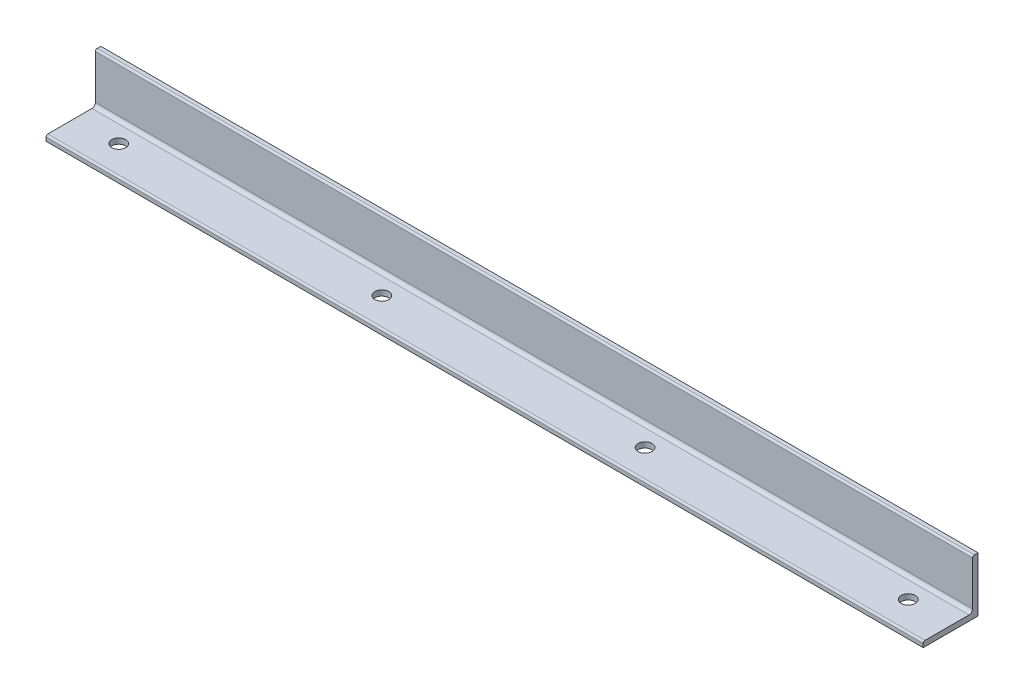
ISO-10303-21;
HEADER;
FILE_DESCRIPTION(('STEP AP214'),'2;1');
FILE_NAME('part.step','',(''),(''),'','','');
FILE_SCHEMA(('AUTOMOTIVE_DESIGN { 1 0 10303 214 1 1 1 1 }'));
ENDSEC;
DATA;
#1=APPLICATION_CONTEXT('core data for automotive mechanical design processes');
#2=APPLICATION_PROTOCOL_DEFINITION('international standard','automotive_design',2000,#1);
#3=PRODUCT_CONTEXT('',#1,'mechanical');
#4=PRODUCT('Part','Part','',(#3));
#5=PRODUCT_RELATED_PRODUCT_CATEGORY('part','',(#4));
#6=PRODUCT_DEFINITION_FORMATION('','',#4);
#7=PRODUCT_DEFINITION_CONTEXT('part definition',#1,'design');
#8=PRODUCT_DEFINITION('design','',#6,#7);
#9=PRODUCT_DEFINITION_SHAPE('','',#8);
#10=(LENGTH_UNIT() NAMED_UNIT(*) SI_UNIT(.MILLI.,.METRE.));
#11=(NAMED_UNIT(*) PLANE_ANGLE_UNIT() SI_UNIT($,.RADIAN.));
#12=(NAMED_UNIT(*) SI_UNIT($,.STERADIAN.) SOLID_ANGLE_UNIT());
#13=UNCERTAINTY_MEASURE_WITH_UNIT(LENGTH_MEASURE(1.E-05),#10,'distance_accuracy_value','');
#14=(GEOMETRIC_REPRESENTATION_CONTEXT(3) GLOBAL_UNCERTAINTY_ASSIGNED_CONTEXT((#13)) GLOBAL_UNIT_ASSIGNED_CONTEXT((#10,
#11,#12)) REPRESENTATION_CONTEXT('',''));
#15=CARTESIAN_POINT('',(0.,0.,0.));
#16=DIRECTION('',(0.,0.,1.));
#17=DIRECTION('',(1.,0.,0.));
#18=AXIS2_PLACEMENT_3D('',#15,#16,#17);
#19=CARTESIAN_POINT('',(-254.,1.5748,-30.3276));
#20=DIRECTION('',(0.,1.,0.));
#21=DIRECTION('',(0.,0.,1.));
#22=AXIS2_PLACEMENT_3D('',#19,#20,#21);
#23=PLANE('',#22);
#24=CARTESIAN_POINT('',(-165.1,1.5748,-25.4));
#25=DIRECTION('',(0.,1.,0.));
#26=DIRECTION('',(0.,0.,1.));
#27=AXIS2_PLACEMENT_3D('',#24,#25,#26);
#28=CIRCLE('',#27,2.01930000000001);
#29=CARTESIAN_POINT('',(-165.1,1.5748,-23.3807));
#30=VERTEX_POINT('',#29);
#31=EDGE_CURVE('E256',#30,#30,#28,.F.);
#32=ORIENTED_EDGE('',*,*,#31,.T.);
#33=EDGE_LOOP('',(#32));
#34=FACE_BOUND('',#33,.T.);
#35=CARTESIAN_POINT('',(-12.7,1.5748,-25.4));
#36=DIRECTION('',(0.,1.,0.));
#37=DIRECTION('',(0.,0.,1.));
#38=AXIS2_PLACEMENT_3D('',#35,#36,#37);
#39=CIRCLE('',#38,2.0193);
#40=CARTESIAN_POINT('',(-12.7,1.5748,-23.3807));
#41=VERTEX_POINT('',#40);
#42=EDGE_CURVE('E149',#41,#41,#39,.F.);
#43=ORIENTED_EDGE('',*,*,#42,.T.);
#44=EDGE_LOOP('',(#43));
#45=FACE_BOUND('',#44,.T.);
#46=DIRECTION('',(0.,0.,1.));
#47=VECTOR('',#46,1.);
#48=CARTESIAN_POINT('',(0.,1.5748,-30.3276));
#49=LINE('',#48,#47);
#50=CARTESIAN_POINT('',(0.,1.5748,-30.3276));
#51=VERTEX_POINT('',#50);
#52=CARTESIAN_POINT('',(0.,1.5748,-17.5514));
#53=VERTEX_POINT('',#52);
#54=EDGE_CURVE('E123',#51,#53,#49,.T.);
#55=ORIENTED_EDGE('',*,*,#54,.F.);
#56=DIRECTION('',(1.,0.,0.));
#57=VECTOR('',#56,1.);
#58=CARTESIAN_POINT('',(-254.,1.5748,-30.3276));
#59=LINE('',#58,#57);
#60=CARTESIAN_POINT('',(-254.,1.5748,-30.3276));
#61=VERTEX_POINT('',#60);
#62=EDGE_CURVE('E118',#61,#51,#59,.T.);
#63=ORIENTED_EDGE('',*,*,#62,.F.);
#64=DIRECTION('',(0.,0.,1.));
#65=VECTOR('',#64,1.);
#66=CARTESIAN_POINT('',(-254.,1.5748,-30.3276));
#67=LINE('',#66,#65);
#68=CARTESIAN_POINT('',(-254.,1.5748,-17.5514));
#69=VERTEX_POINT('',#68);
#70=EDGE_CURVE('E121',#61,#69,#67,.T.);
#71=ORIENTED_EDGE('',*,*,#70,.T.);
#72=DIRECTION('',(1.,0.,0.));
#73=VECTOR('',#72,1.);
#74=CARTESIAN_POINT('',(-254.,1.5748,-17.5514));
#75=LINE('',#74,#73);
#76=EDGE_CURVE('E51',#69,#53,#75,.T.);
#77=ORIENTED_EDGE('',*,*,#76,.T.);
#78=EDGE_LOOP('',(#55,#63,#71,#77));
#79=FACE_BOUND('',#78,.T.);
#80=CARTESIAN_POINT('',(-88.9,1.5748,-25.4));
#81=DIRECTION('',(0.,1.,0.));
#82=DIRECTION('',(0.,0.,1.));
#83=AXIS2_PLACEMENT_3D('',#80,#81,#82);
#84=CIRCLE('',#83,2.01930000000001);
#85=CARTESIAN_POINT('',(-88.9,1.5748,-23.3807));
#86=VERTEX_POINT('',#85);
#87=EDGE_CURVE('E249',#86,#86,#84,.F.);
#88=ORIENTED_EDGE('',*,*,#87,.T.);
#89=EDGE_LOOP('',(#88));
#90=FACE_BOUND('',#89,.T.);
#91=CARTESIAN_POINT('',(-241.3,1.5748,-25.4));
#92=DIRECTION('',(0.,1.,0.));
#93=DIRECTION('',(0.,0.,1.));
#94=AXIS2_PLACEMENT_3D('',#91,#92,#93);
#95=CIRCLE('',#94,2.01930000000001);
#96=CARTESIAN_POINT('',(-241.3,1.5748,-23.3807));
#97=VERTEX_POINT('',#96);
#98=EDGE_CURVE('E262',#97,#97,#95,.F.);
#99=ORIENTED_EDGE('',*,*,#98,.T.);
#100=EDGE_LOOP('',(#99));
#101=FACE_BOUND('',#100,.T.);
#102=ADVANCED_FACE('F41',(#34,#45,#79,#90,#101),#23,.T.);
#103=CARTESIAN_POINT('',(-254.,0.,-17.0434));
#104=DIRECTION('',(0.,-1.,0.));
#105=DIRECTION('',(0.,0.,-1.));
#106=AXIS2_PLACEMENT_3D('',#103,#104,#105);
#107=PLANE('',#106);
#108=CARTESIAN_POINT('',(-165.1,0.,-25.4));
#109=DIRECTION('',(0.,1.,0.));
#110=DIRECTION('',(0.,0.,1.));
#111=AXIS2_PLACEMENT_3D('',#108,#109,#110);
#112=CIRCLE('',#111,2.01930000000001);
#113=CARTESIAN_POINT('',(-165.1,0.,-23.3807));
#114=VERTEX_POINT('',#113);
#115=EDGE_CURVE('E259',#114,#114,#112,.T.);
#116=ORIENTED_EDGE('',*,*,#115,.T.);
#117=EDGE_LOOP('',(#116));
#118=FACE_BOUND('',#117,.T.);
#119=CARTESIAN_POINT('',(-12.7,0.,-25.4));
#120=DIRECTION('',(0.,1.,0.));
#121=DIRECTION('',(0.,0.,1.));
#122=AXIS2_PLACEMENT_3D('',#119,#120,#121);
#123=CIRCLE('',#122,2.0193);
#124=CARTESIAN_POINT('',(-12.7,0.,-23.3807));
#125=VERTEX_POINT('',#124);
#126=EDGE_CURVE('E246',#125,#125,#123,.T.);
#127=ORIENTED_EDGE('',*,*,#126,.T.);
#128=EDGE_LOOP('',(#127));
#129=FACE_BOUND('',#128,.T.);
#130=DIRECTION('',(0.,0.,-1.));
#131=VECTOR('',#130,1.);
#132=CARTESIAN_POINT('',(0.,0.,-17.0434));
#133=LINE('',#132,#131);
#134=CARTESIAN_POINT('',(0.,0.,-17.0434));
#135=VERTEX_POINT('',#134);
#136=CARTESIAN_POINT('',(0.,0.,-32.9184));
#137=VERTEX_POINT('',#136);
#138=EDGE_CURVE('E148',#135,#137,#133,.T.);
#139=ORIENTED_EDGE('',*,*,#138,.F.);
#140=DIRECTION('',(1.,0.,0.));
#141=VECTOR('',#140,1.);
#142=CARTESIAN_POINT('',(-254.,0.,-17.0434));
#143=LINE('',#142,#141);
#144=CARTESIAN_POINT('',(-254.,0.,-17.0434));
#145=VERTEX_POINT('',#144);
#146=EDGE_CURVE('E45',#145,#135,#143,.T.);
#147=ORIENTED_EDGE('',*,*,#146,.F.);
#148=DIRECTION('',(0.,0.,-1.));
#149=VECTOR('',#148,1.);
#150=CARTESIAN_POINT('',(-254.,0.,-17.0434));
#151=LINE('',#150,#149);
#152=CARTESIAN_POINT('',(-254.,0.,-32.9184));
#153=VERTEX_POINT('',#152);
#154=EDGE_CURVE('E238',#145,#153,#151,.T.);
#155=ORIENTED_EDGE('',*,*,#154,.T.);
#156=DIRECTION('',(1.,0.,0.));
#157=VECTOR('',#156,1.);
#158=CARTESIAN_POINT('',(-254.,0.,-32.9184));
#159=LINE('',#158,#157);
#160=EDGE_CURVE('E180',#153,#137,#159,.T.);
#161=ORIENTED_EDGE('',*,*,#160,.T.);
#162=EDGE_LOOP('',(#139,#147,#155,#161));
#163=FACE_BOUND('',#162,.T.);
#164=CARTESIAN_POINT('',(-88.9,0.,-25.4));
#165=DIRECTION('',(0.,1.,0.));
#166=DIRECTION('',(0.,0.,1.));
#167=AXIS2_PLACEMENT_3D('',#164,#165,#166);
#168=CIRCLE('',#167,2.01930000000001);
#169=CARTESIAN_POINT('',(-88.9,0.,-23.3807));
#170=VERTEX_POINT('',#169);
#171=EDGE_CURVE('E253',#170,#170,#168,.T.);
#172=ORIENTED_EDGE('',*,*,#171,.T.);
#173=EDGE_LOOP('',(#172));
#174=FACE_BOUND('',#173,.T.);
#175=CARTESIAN_POINT('',(-241.3,0.,-25.4));
#176=DIRECTION('',(0.,1.,0.));
#177=DIRECTION('',(0.,0.,1.));
#178=AXIS2_PLACEMENT_3D('',#175,#176,#177);
#179=CIRCLE('',#178,2.01930000000001);
#180=CARTESIAN_POINT('',(-241.3,0.,-23.3807));
#181=VERTEX_POINT('',#180);
#182=EDGE_CURVE('E266',#181,#181,#179,.T.);
#183=ORIENTED_EDGE('',*,*,#182,.T.);
#184=EDGE_LOOP('',(#183));
#185=FACE_BOUND('',#184,.T.);
#186=ADVANCED_FACE('F182',(#118,#129,#163,#174,#185),#107,.T.);
#187=CARTESIAN_POINT('',(-254.,1.0668,-17.0434));
#188=DIRECTION('',(0.,0.,1.));
#189=DIRECTION('',(1.,0.,0.));
#190=AXIS2_PLACEMENT_3D('',#187,#188,#189);
#191=PLANE('',#190);
#192=DIRECTION('',(0.,-1.,0.));
#193=VECTOR('',#192,1.);
#194=CARTESIAN_POINT('',(0.,1.0668,-17.0434));
#195=LINE('',#194,#193);
#196=CARTESIAN_POINT('',(0.,1.0668,-17.0434));
#197=VERTEX_POINT('',#196);
#198=EDGE_CURVE('E146',#197,#135,#195,.T.);
#199=ORIENTED_EDGE('',*,*,#198,.F.);
#200=DIRECTION('',(1.,0.,0.));
#201=VECTOR('',#200,1.);
#202=CARTESIAN_POINT('',(-254.,1.0668,-17.0434));
#203=LINE('',#202,#201);
#204=CARTESIAN_POINT('',(-254.,1.0668,-17.0434));
#205=VERTEX_POINT('',#204);
#206=EDGE_CURVE('E12',#205,#197,#203,.T.);
#207=ORIENTED_EDGE('',*,*,#206,.F.);
#208=DIRECTION('',(0.,-1.,0.));
#209=VECTOR('',#208,1.);
#210=CARTESIAN_POINT('',(-254.,1.0668,-17.0434));
#211=LINE('',#210,#209);
#212=EDGE_CURVE('E171',#205,#145,#211,.T.);
#213=ORIENTED_EDGE('',*,*,#212,.T.);
#214=ORIENTED_EDGE('',*,*,#146,.T.);
#215=EDGE_LOOP('',(#199,#207,#213,#214));
#216=FACE_BOUND('',#215,.T.);
#217=ADVANCED_FACE('F43',(#216),#191,.T.);
#218=CARTESIAN_POINT('',(-254.,1.0668,-17.5514));
#219=DIRECTION('',(1.,0.,0.));
#220=DIRECTION('',(0.,0.,-1.));
#221=AXIS2_PLACEMENT_3D('',#218,#219,#220);
#222=CYLINDRICAL_SURFACE('',#221,0.508000000000001);
#223=CARTESIAN_POINT('',(0.,1.0668,-17.5514));
#224=DIRECTION('',(1.,0.,0.));
#225=DIRECTION('',(0.,0.,-1.));
#226=AXIS2_PLACEMENT_3D('',#223,#224,#225);
#227=CIRCLE('',#226,0.508000000000001);
#228=EDGE_CURVE('E169',#53,#197,#227,.T.);
#229=ORIENTED_EDGE('',*,*,#228,.F.);
#230=ORIENTED_EDGE('',*,*,#76,.F.);
#231=CARTESIAN_POINT('',(-254.,1.0668,-17.5514));
#232=DIRECTION('',(1.,0.,0.));
#233=DIRECTION('',(0.,0.,-1.));
#234=AXIS2_PLACEMENT_3D('',#231,#232,#233);
#235=CIRCLE('',#234,0.508000000000001);
#236=EDGE_CURVE('E136',#69,#205,#235,.T.);
#237=ORIENTED_EDGE('',*,*,#236,.T.);
#238=ORIENTED_EDGE('',*,*,#206,.T.);
#239=EDGE_LOOP('',(#229,#230,#237,#238));
#240=FACE_BOUND('',#239,.T.);
#241=ADVANCED_FACE('F186',(#240),#222,.T.);
#242=CARTESIAN_POINT('',(-254.,2.5908,-30.3276));
#243=DIRECTION('',(1.,0.,0.));
#244=DIRECTION('',(0.,0.,-1.));
#245=AXIS2_PLACEMENT_3D('',#242,#243,#244);
#246=CYLINDRICAL_SURFACE('',#245,1.016);
#247=CARTESIAN_POINT('',(0.,2.5908,-30.3276));
#248=DIRECTION('',(-1.,0.,0.));
#249=DIRECTION('',(0.,0.,1.));
#250=AXIS2_PLACEMENT_3D('',#247,#248,#249);
#251=CIRCLE('',#250,1.016);
#252=CARTESIAN_POINT('',(0.,2.5908,-31.3436));
#253=VERTEX_POINT('',#252);
#254=EDGE_CURVE('E166',#253,#51,#251,.T.);
#255=ORIENTED_EDGE('',*,*,#254,.F.);
#256=DIRECTION('',(1.,0.,0.));
#257=VECTOR('',#256,1.);
#258=CARTESIAN_POINT('',(-254.,2.5908,-31.3436));
#259=LINE('',#258,#257);
#260=CARTESIAN_POINT('',(-254.,2.5908,-31.3436));
#261=VERTEX_POINT('',#260);
#262=EDGE_CURVE('E128',#261,#253,#259,.T.);
#263=ORIENTED_EDGE('',*,*,#262,.F.);
#264=CARTESIAN_POINT('',(-254.,2.5908,-30.3276));
#265=DIRECTION('',(-1.,0.,0.));
#266=DIRECTION('',(0.,0.,1.));
#267=AXIS2_PLACEMENT_3D('',#264,#265,#266);
#268=CIRCLE('',#267,1.016);
#269=EDGE_CURVE('E134',#261,#61,#268,.T.);
#270=ORIENTED_EDGE('',*,*,#269,.T.);
#271=ORIENTED_EDGE('',*,*,#62,.T.);
#272=EDGE_LOOP('',(#255,#263,#270,#271));
#273=FACE_BOUND('',#272,.T.);
#274=ADVANCED_FACE('F138',(#273),#246,.F.);
#275=CARTESIAN_POINT('',(-254.,15.367,-31.3436));
#276=DIRECTION('',(0.,0.,1.));
#277=DIRECTION('',(1.,0.,0.));
#278=AXIS2_PLACEMENT_3D('',#275,#276,#277);
#279=PLANE('',#278);
#280=DIRECTION('',(0.,-1.,0.));
#281=VECTOR('',#280,1.);
#282=CARTESIAN_POINT('',(0.,15.367,-31.3436));
#283=LINE('',#282,#281);
#284=CARTESIAN_POINT('',(0.,15.367,-31.3436));
#285=VERTEX_POINT('',#284);
#286=EDGE_CURVE('E163',#285,#253,#283,.T.);
#287=ORIENTED_EDGE('',*,*,#286,.F.);
#288=DIRECTION('',(1.,0.,0.));
#289=VECTOR('',#288,1.);
#290=CARTESIAN_POINT('',(-254.,15.367,-31.3436));
#291=LINE('',#290,#289);
#292=CARTESIAN_POINT('',(-254.,15.367,-31.3436));
#293=VERTEX_POINT('',#292);
#294=EDGE_CURVE('E175',#293,#285,#291,.T.);
#295=ORIENTED_EDGE('',*,*,#294,.F.);
#296=DIRECTION('',(0.,-1.,0.));
#297=VECTOR('',#296,1.);
#298=CARTESIAN_POINT('',(-254.,15.367,-31.3436));
#299=LINE('',#298,#297);
#300=EDGE_CURVE('E139',#293,#261,#299,.T.);
#301=ORIENTED_EDGE('',*,*,#300,.T.);
#302=ORIENTED_EDGE('',*,*,#262,.T.);
#303=EDGE_LOOP('',(#287,#295,#301,#302));
#304=FACE_BOUND('',#303,.T.);
#305=ADVANCED_FACE('F193',(#304),#279,.T.);
#306=CARTESIAN_POINT('',(-254.,15.367,-31.8516));
#307=DIRECTION('',(1.,0.,0.));
#308=DIRECTION('',(0.,0.,-1.));
#309=AXIS2_PLACEMENT_3D('',#306,#307,#308);
#310=CYLINDRICAL_SURFACE('',#309,0.507999999999999);
#311=CARTESIAN_POINT('',(0.,15.367,-31.8516));
#312=DIRECTION('',(1.,0.,0.));
#313=DIRECTION('',(0.,0.,-1.));
#314=AXIS2_PLACEMENT_3D('',#311,#312,#313);
#315=CIRCLE('',#314,0.507999999999999);
#316=CARTESIAN_POINT('',(0.,15.875,-31.8516));
#317=VERTEX_POINT('',#316);
#318=EDGE_CURVE('E160',#317,#285,#315,.T.);
#319=ORIENTED_EDGE('',*,*,#318,.F.);
#320=DIRECTION('',(1.,0.,0.));
#321=VECTOR('',#320,1.);
#322=CARTESIAN_POINT('',(-254.,15.875,-31.8516));
#323=LINE('',#322,#321);
#324=CARTESIAN_POINT('',(-254.,15.875,-31.8516));
#325=VERTEX_POINT('',#324);
#326=EDGE_CURVE('E177',#325,#317,#323,.T.);
#327=ORIENTED_EDGE('',*,*,#326,.F.);
#328=CARTESIAN_POINT('',(-254.,15.367,-31.8516));
#329=DIRECTION('',(1.,0.,0.));
#330=DIRECTION('',(0.,0.,-1.));
#331=AXIS2_PLACEMENT_3D('',#328,#329,#330);
#332=CIRCLE('',#331,0.507999999999999);
#333=EDGE_CURVE('E141',#325,#293,#332,.T.);
#334=ORIENTED_EDGE('',*,*,#333,.T.);
#335=ORIENTED_EDGE('',*,*,#294,.T.);
#336=EDGE_LOOP('',(#319,#327,#334,#335));
#337=FACE_BOUND('',#336,.T.);
#338=ADVANCED_FACE('F208',(#337),#310,.T.);
#339=CARTESIAN_POINT('',(-254.,15.875,-32.9184));
#340=DIRECTION('',(0.,1.,0.));
#341=DIRECTION('',(0.,0.,1.));
#342=AXIS2_PLACEMENT_3D('',#339,#340,#341);
#343=PLANE('',#342);
#344=DIRECTION('',(0.,0.,1.));
#345=VECTOR('',#344,1.);
#346=CARTESIAN_POINT('',(0.,15.875,-32.9184));
#347=LINE('',#346,#345);
#348=CARTESIAN_POINT('',(0.,15.875,-32.9184));
#349=VERTEX_POINT('',#348);
#350=EDGE_CURVE('E157',#349,#317,#347,.T.);
#351=ORIENTED_EDGE('',*,*,#350,.F.);
#352=DIRECTION('',(1.,0.,0.));
#353=VECTOR('',#352,1.);
#354=CARTESIAN_POINT('',(-254.,15.875,-32.9184));
#355=LINE('',#354,#353);
#356=CARTESIAN_POINT('',(-254.,15.875,-32.9184));
#357=VERTEX_POINT('',#356);
#358=EDGE_CURVE('E179',#357,#349,#355,.T.);
#359=ORIENTED_EDGE('',*,*,#358,.F.);
#360=DIRECTION('',(0.,0.,1.));
#361=VECTOR('',#360,1.);
#362=CARTESIAN_POINT('',(-254.,15.875,-32.9184));
#363=LINE('',#362,#361);
#364=EDGE_CURVE('E230',#357,#325,#363,.T.);
#365=ORIENTED_EDGE('',*,*,#364,.T.);
#366=ORIENTED_EDGE('',*,*,#326,.T.);
#367=EDGE_LOOP('',(#351,#359,#365,#366));
#368=FACE_BOUND('',#367,.T.);
#369=ADVANCED_FACE('F212',(#368),#343,.T.);
#370=CARTESIAN_POINT('',(-254.,0.,-32.9184));
#371=DIRECTION('',(0.,0.,-1.));
#372=DIRECTION('',(-1.,0.,0.));
#373=AXIS2_PLACEMENT_3D('',#370,#371,#372);
#374=PLANE('',#373);
#375=DIRECTION('',(0.,1.,0.));
#376=VECTOR('',#375,1.);
#377=CARTESIAN_POINT('',(0.,0.,-32.9184));
#378=LINE('',#377,#376);
#379=EDGE_CURVE('E154',#137,#349,#378,.T.);
#380=ORIENTED_EDGE('',*,*,#379,.F.);
#381=ORIENTED_EDGE('',*,*,#160,.F.);
#382=DIRECTION('',(0.,1.,0.));
#383=VECTOR('',#382,1.);
#384=CARTESIAN_POINT('',(-254.,0.,-32.9184));
#385=LINE('',#384,#383);
#386=EDGE_CURVE('E234',#153,#357,#385,.T.);
#387=ORIENTED_EDGE('',*,*,#386,.T.);
#388=ORIENTED_EDGE('',*,*,#358,.T.);
#389=EDGE_LOOP('',(#380,#381,#387,#388));
#390=FACE_BOUND('',#389,.T.);
#391=ADVANCED_FACE('F216',(#390),#374,.T.);
#392=CARTESIAN_POINT('',(-254.,15.367,-31.8516));
#393=DIRECTION('',(1.,0.,0.));
#394=DIRECTION('',(0.,0.,-1.));
#395=AXIS2_PLACEMENT_3D('',#392,#393,#394);
#396=PLANE('',#395);
#397=ORIENTED_EDGE('',*,*,#212,.F.);
#398=ORIENTED_EDGE('',*,*,#236,.F.);
#399=ORIENTED_EDGE('',*,*,#70,.F.);
#400=ORIENTED_EDGE('',*,*,#269,.F.);
#401=ORIENTED_EDGE('',*,*,#300,.F.);
#402=ORIENTED_EDGE('',*,*,#333,.F.);
#403=ORIENTED_EDGE('',*,*,#364,.F.);
#404=ORIENTED_EDGE('',*,*,#386,.F.);
#405=ORIENTED_EDGE('',*,*,#154,.F.);
#406=EDGE_LOOP('',(#397,#398,#399,#400,#401,#402,#403,#404,#405));
#407=FACE_BOUND('',#406,.T.);
#408=ADVANCED_FACE('F132',(#407),#396,.F.);
#409=CARTESIAN_POINT('',(0.,15.367,-31.8516));
#410=DIRECTION('',(1.,0.,0.));
#411=DIRECTION('',(0.,0.,-1.));
#412=AXIS2_PLACEMENT_3D('',#409,#410,#411);
#413=PLANE('',#412);
#414=ORIENTED_EDGE('',*,*,#198,.T.);
#415=ORIENTED_EDGE('',*,*,#138,.T.);
#416=ORIENTED_EDGE('',*,*,#379,.T.);
#417=ORIENTED_EDGE('',*,*,#350,.T.);
#418=ORIENTED_EDGE('',*,*,#318,.T.);
#419=ORIENTED_EDGE('',*,*,#286,.T.);
#420=ORIENTED_EDGE('',*,*,#254,.T.);
#421=ORIENTED_EDGE('',*,*,#54,.T.);
#422=ORIENTED_EDGE('',*,*,#228,.T.);
#423=EDGE_LOOP('',(#414,#415,#416,#417,#418,#419,#420,#421,#422));
#424=FACE_BOUND('',#423,.T.);
#425=ADVANCED_FACE('F185',(#424),#413,.T.);
#426=CARTESIAN_POINT('',(-12.7,15.875,-25.4));
#427=DIRECTION('',(0.,-1.,0.));
#428=DIRECTION('',(0.,0.,-1.));
#429=AXIS2_PLACEMENT_3D('',#426,#427,#428);
#430=CYLINDRICAL_SURFACE('',#429,2.0193);
#431=ORIENTED_EDGE('',*,*,#42,.F.);
#432=EDGE_LOOP('',(#431));
#433=FACE_BOUND('',#432,.T.);
#434=ORIENTED_EDGE('',*,*,#126,.F.);
#435=EDGE_LOOP('',(#434));
#436=FACE_BOUND('',#435,.T.);
#437=ADVANCED_FACE('F286',(#433,#436),#430,.F.);
#438=CARTESIAN_POINT('',(-88.9,15.875,-25.4));
#439=DIRECTION('',(0.,-1.,0.));
#440=DIRECTION('',(0.,0.,-1.));
#441=AXIS2_PLACEMENT_3D('',#438,#439,#440);
#442=CYLINDRICAL_SURFACE('',#441,2.01930000000001);
#443=ORIENTED_EDGE('',*,*,#87,.F.);
#444=EDGE_LOOP('',(#443));
#445=FACE_BOUND('',#444,.T.);
#446=ORIENTED_EDGE('',*,*,#171,.F.);
#447=EDGE_LOOP('',(#446));
#448=FACE_BOUND('',#447,.T.);
#449=ADVANCED_FACE('F279',(#445,#448),#442,.F.);
#450=CARTESIAN_POINT('',(-165.1,15.875,-25.4));
#451=DIRECTION('',(0.,-1.,0.));
#452=DIRECTION('',(0.,0.,-1.));
#453=AXIS2_PLACEMENT_3D('',#450,#451,#452);
#454=CYLINDRICAL_SURFACE('',#453,2.01930000000001);
#455=ORIENTED_EDGE('',*,*,#31,.F.);
#456=EDGE_LOOP('',(#455));
#457=FACE_BOUND('',#456,.T.);
#458=ORIENTED_EDGE('',*,*,#115,.F.);
#459=EDGE_LOOP('',(#458));
#460=FACE_BOUND('',#459,.T.);
#461=ADVANCED_FACE('F273',(#457,#460),#454,.F.);
#462=CARTESIAN_POINT('',(-241.3,15.875,-25.4));
#463=DIRECTION('',(0.,-1.,0.));
#464=DIRECTION('',(0.,0.,-1.));
#465=AXIS2_PLACEMENT_3D('',#462,#463,#464);
#466=CYLINDRICAL_SURFACE('',#465,2.01930000000001);
#467=ORIENTED_EDGE('',*,*,#98,.F.);
#468=EDGE_LOOP('',(#467));
#469=FACE_BOUND('',#468,.T.);
#470=ORIENTED_EDGE('',*,*,#182,.F.);
#471=EDGE_LOOP('',(#470));
#472=FACE_BOUND('',#471,.T.);
#473=ADVANCED_FACE('F271',(#469,#472),#466,.F.);
#474=CLOSED_SHELL('',(#102,#186,#217,#241,#274,#305,#338,#369,#391,#408,#425,#437,#449,#461,#473));
#475=MANIFOLD_SOLID_BREP('B2',#474);
#476=ADVANCED_BREP_SHAPE_REPRESENTATION('',(#18,#475),#14);
#477=SHAPE_DEFINITION_REPRESENTATION(#9,#476);
ENDSEC;
END-ISO-10303-21;
